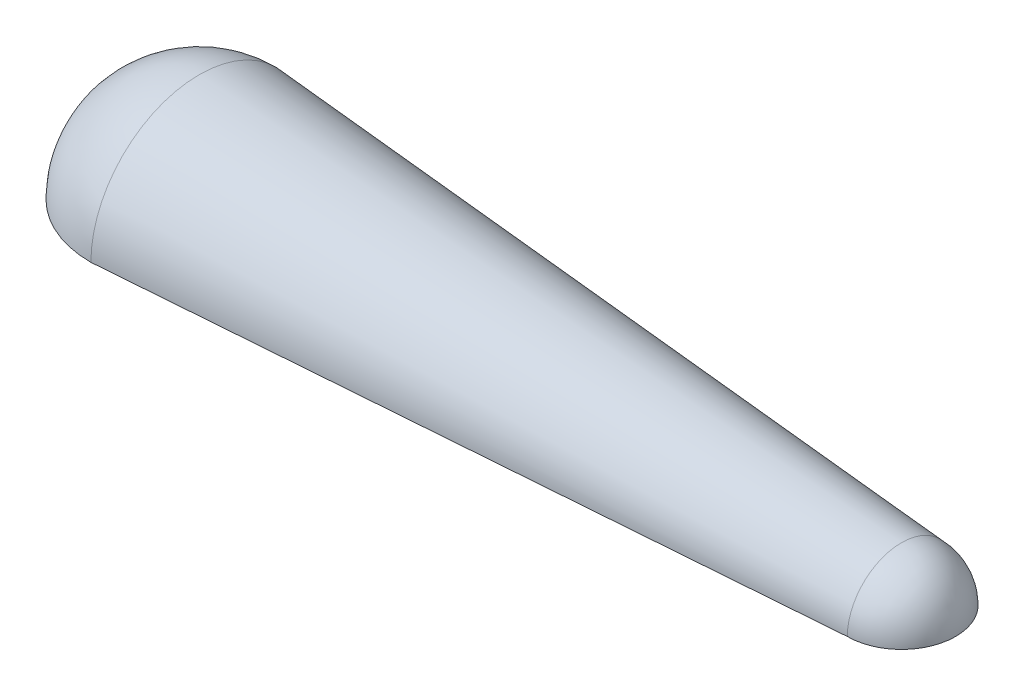
ISO-10303-21;
HEADER;
FILE_DESCRIPTION(('STEP AP214'),'2;1');
FILE_NAME('part.step','',(''),(''),'','','');
FILE_SCHEMA(('AUTOMOTIVE_DESIGN { 1 0 10303 214 1 1 1 1 }'));
ENDSEC;
DATA;
#1=APPLICATION_CONTEXT('core data for automotive mechanical design processes');
#2=APPLICATION_PROTOCOL_DEFINITION('international standard','automotive_design',2000,#1);
#3=PRODUCT_CONTEXT('',#1,'mechanical');
#4=PRODUCT('Part','Part','',(#3));
#5=PRODUCT_RELATED_PRODUCT_CATEGORY('part','',(#4));
#6=PRODUCT_DEFINITION_FORMATION('','',#4);
#7=PRODUCT_DEFINITION_CONTEXT('part definition',#1,'design');
#8=PRODUCT_DEFINITION('design','',#6,#7);
#9=PRODUCT_DEFINITION_SHAPE('','',#8);
#10=(LENGTH_UNIT() NAMED_UNIT(*) SI_UNIT(.MILLI.,.METRE.));
#11=(NAMED_UNIT(*) PLANE_ANGLE_UNIT() SI_UNIT($,.RADIAN.));
#12=(NAMED_UNIT(*) SI_UNIT($,.STERADIAN.) SOLID_ANGLE_UNIT());
#13=UNCERTAINTY_MEASURE_WITH_UNIT(LENGTH_MEASURE(1.E-05),#10,'distance_accuracy_value','');
#14=(GEOMETRIC_REPRESENTATION_CONTEXT(3) GLOBAL_UNCERTAINTY_ASSIGNED_CONTEXT((#13)) GLOBAL_UNIT_ASSIGNED_CONTEXT((#10,
#11,#12)) REPRESENTATION_CONTEXT('',''));
#15=CARTESIAN_POINT('',(0.,0.,0.));
#16=DIRECTION('',(0.,0.,1.));
#17=DIRECTION('',(1.,0.,0.));
#18=AXIS2_PLACEMENT_3D('',#15,#16,#17);
#19=CARTESIAN_POINT('',(0.,0.,0.));
#20=DIRECTION('',(-1.,0.,0.));
#21=DIRECTION('',(0.,0.,1.));
#22=AXIS2_PLACEMENT_3D('',#19,#20,#21);
#23=SPHERICAL_SURFACE('',#22,18.5169503651855);
#24=CARTESIAN_POINT('',(0.,0.,0.));
#25=DIRECTION('',(-1.,0.,0.));
#26=DIRECTION('',(0.,0.,1.));
#27=AXIS2_PLACEMENT_3D('',#24,#25,#26);
#28=CIRCLE('',#27,18.5169503651855);
#29=CARTESIAN_POINT('',(0.,-1.29303173304659E-13,18.5169503651855));
#30=VERTEX_POINT('',#29);
#31=CARTESIAN_POINT('',(0.,0.,-18.5169503651855));
#32=VERTEX_POINT('',#31);
#33=EDGE_CURVE('E58',#30,#32,#28,.T.);
#34=ORIENTED_EDGE('',*,*,#33,.T.);
#35=CARTESIAN_POINT('',(0.,0.,0.));
#36=DIRECTION('',(0.,-1.,0.));
#37=DIRECTION('',(0.,0.,-1.));
#38=AXIS2_PLACEMENT_3D('',#35,#36,#37);
#39=CIRCLE('',#38,18.5169503651855);
#40=EDGE_CURVE('E92',#30,#32,#39,.T.);
#41=ORIENTED_EDGE('',*,*,#40,.F.);
#42=EDGE_LOOP('',(#34,#41));
#43=FACE_BOUND('',#42,.T.);
#44=ADVANCED_FACE('F42',(#43),#23,.T.);
#45=CARTESIAN_POINT('',(0.,0.,0.));
#46=DIRECTION('',(-1.,0.,0.));
#47=DIRECTION('',(0.,0.,1.));
#48=AXIS2_PLACEMENT_3D('',#45,#46,#47);
#49=SPHERICAL_SURFACE('',#48,14.);
#50=CARTESIAN_POINT('',(0.,0.,0.));
#51=DIRECTION('',(-1.,0.,0.));
#52=DIRECTION('',(0.,0.,1.));
#53=AXIS2_PLACEMENT_3D('',#50,#51,#52);
#54=CIRCLE('',#53,14.);
#55=CARTESIAN_POINT('',(0.,0.,14.));
#56=VERTEX_POINT('',#55);
#57=CARTESIAN_POINT('',(0.,0.,-14.));
#58=VERTEX_POINT('',#57);
#59=EDGE_CURVE('E11',#56,#58,#54,.T.);
#60=ORIENTED_EDGE('',*,*,#59,.F.);
#61=CARTESIAN_POINT('',(0.,0.,0.));
#62=DIRECTION('',(0.,1.,0.));
#63=DIRECTION('',(0.,0.,-1.));
#64=AXIS2_PLACEMENT_3D('',#61,#62,#63);
#65=CIRCLE('',#64,14.);
#66=EDGE_CURVE('E85',#58,#56,#65,.T.);
#67=ORIENTED_EDGE('',*,*,#66,.F.);
#68=EDGE_LOOP('',(#60,#67));
#69=FACE_BOUND('',#68,.T.);
#70=ADVANCED_FACE('F44',(#69),#49,.F.);
#71=CARTESIAN_POINT('',(0.,0.,0.));
#72=DIRECTION('',(-1.,0.,0.));
#73=DIRECTION('',(0.,0.,1.));
#74=AXIS2_PLACEMENT_3D('',#71,#72,#73);
#75=CONICAL_SURFACE('',#74,14.,0.0665681637758238);
#76=CARTESIAN_POINT('',(120.,0.,0.));
#77=DIRECTION('',(-1.,0.,0.));
#78=DIRECTION('',(0.,0.,1.));
#79=AXIS2_PLACEMENT_3D('',#76,#77,#78);
#80=CIRCLE('',#79,6.);
#81=CARTESIAN_POINT('',(120.,0.,6.));
#82=VERTEX_POINT('',#81);
#83=CARTESIAN_POINT('',(120.,0.,-6.));
#84=VERTEX_POINT('',#83);
#85=EDGE_CURVE('E51',#82,#84,#80,.T.);
#86=ORIENTED_EDGE('',*,*,#85,.F.);
#87=DIRECTION('',(0.997785157856609,0.,-0.0665190105237739));
#88=VECTOR('',#87,1.);
#89=CARTESIAN_POINT('',(0.,0.,14.));
#90=LINE('',#89,#88);
#91=EDGE_CURVE('E91',#56,#82,#90,.T.);
#92=ORIENTED_EDGE('',*,*,#91,.F.);
#93=ORIENTED_EDGE('',*,*,#59,.T.);
#94=DIRECTION('',(0.997785157856609,0.,0.0665190105237739));
#95=VECTOR('',#94,1.);
#96=CARTESIAN_POINT('',(0.,0.,-14.));
#97=LINE('',#96,#95);
#98=EDGE_CURVE('E97',#58,#84,#97,.T.);
#99=ORIENTED_EDGE('',*,*,#98,.T.);
#100=EDGE_LOOP('',(#86,#92,#93,#99));
#101=FACE_BOUND('',#100,.T.);
#102=ADVANCED_FACE('F96',(#101),#75,.F.);
#103=CARTESIAN_POINT('',(120.,0.,0.));
#104=DIRECTION('',(-1.,0.,0.));
#105=DIRECTION('',(0.,0.,1.));
#106=AXIS2_PLACEMENT_3D('',#103,#104,#105);
#107=SPHERICAL_SURFACE('',#106,6.);
#108=ORIENTED_EDGE('',*,*,#85,.T.);
#109=CARTESIAN_POINT('',(120.,0.,0.));
#110=DIRECTION('',(0.,1.,0.));
#111=DIRECTION('',(0.,0.,-1.));
#112=AXIS2_PLACEMENT_3D('',#109,#110,#111);
#113=CIRCLE('',#112,6.);
#114=EDGE_CURVE('E101',#82,#84,#113,.T.);
#115=ORIENTED_EDGE('',*,*,#114,.F.);
#116=EDGE_LOOP('',(#108,#115));
#117=FACE_BOUND('',#116,.T.);
#118=ADVANCED_FACE('F135',(#117),#107,.F.);
#119=CARTESIAN_POINT('',(120.,0.,0.));
#120=DIRECTION('',(-1.,0.,0.));
#121=DIRECTION('',(0.,0.,1.));
#122=AXIS2_PLACEMENT_3D('',#119,#120,#121);
#123=SPHERICAL_SURFACE('',#122,9.25847518259273);
#124=CARTESIAN_POINT('',(120.,0.,0.));
#125=DIRECTION('',(-1.,0.,0.));
#126=DIRECTION('',(0.,0.,1.));
#127=AXIS2_PLACEMENT_3D('',#124,#125,#126);
#128=CIRCLE('',#127,9.25847518259273);
#129=CARTESIAN_POINT('',(120.,0.,9.25847518259273));
#130=VERTEX_POINT('',#129);
#131=CARTESIAN_POINT('',(120.,0.,-9.25847518259273));
#132=VERTEX_POINT('',#131);
#133=EDGE_CURVE('E65',#130,#132,#128,.T.);
#134=ORIENTED_EDGE('',*,*,#133,.F.);
#135=CARTESIAN_POINT('',(120.,0.,0.));
#136=DIRECTION('',(0.,-1.,0.));
#137=DIRECTION('',(0.,0.,-1.));
#138=AXIS2_PLACEMENT_3D('',#135,#136,#137);
#139=CIRCLE('',#138,9.25847518259273);
#140=EDGE_CURVE('E123',#132,#130,#139,.T.);
#141=ORIENTED_EDGE('',*,*,#140,.F.);
#142=EDGE_LOOP('',(#134,#141));
#143=FACE_BOUND('',#142,.T.);
#144=ADVANCED_FACE('F137',(#143),#123,.T.);
#145=CARTESIAN_POINT('',(120.,0.,0.));
#146=DIRECTION('',(-1.,0.,0.));
#147=DIRECTION('',(0.,0.,1.));
#148=AXIS2_PLACEMENT_3D('',#145,#146,#147);
#149=CONICAL_SURFACE('',#148,9.25847518259273,0.0770014120103553);
#150=DIRECTION('',(-0.997036855802212,0.,0.0769253415464591));
#151=VECTOR('',#150,1.);
#152=CARTESIAN_POINT('',(0.,-1.29303173304659E-13,18.5169503651855));
#153=LINE('',#152,#151);
#154=EDGE_CURVE('E126',#130,#30,#153,.T.);
#155=ORIENTED_EDGE('',*,*,#154,.F.);
#156=ORIENTED_EDGE('',*,*,#133,.T.);
#157=DIRECTION('',(-0.997036855802212,0.,-0.0769253415464591));
#158=VECTOR('',#157,1.);
#159=CARTESIAN_POINT('',(0.,0.,-18.5169503651855));
#160=LINE('',#159,#158);
#161=EDGE_CURVE('E104',#132,#32,#160,.T.);
#162=ORIENTED_EDGE('',*,*,#161,.T.);
#163=ORIENTED_EDGE('',*,*,#33,.F.);
#164=EDGE_LOOP('',(#155,#156,#162,#163));
#165=FACE_BOUND('',#164,.T.);
#166=ADVANCED_FACE('F143',(#165),#149,.T.);
#167=CARTESIAN_POINT('',(0.,0.,0.));
#168=DIRECTION('',(0.,-1.,0.));
#169=DIRECTION('',(0.,0.,-1.));
#170=AXIS2_PLACEMENT_3D('',#167,#168,#169);
#171=PLANE('',#170);
#172=CARTESIAN_POINT('',(-16.,0.,0.));
#173=DIRECTION('',(0.,-1.,0.));
#174=DIRECTION('',(0.,0.,-1.));
#175=AXIS2_PLACEMENT_3D('',#172,#173,#174);
#176=CIRCLE('',#175,1.);
#177=CARTESIAN_POINT('',(-16.,0.,-1.));
#178=VERTEX_POINT('',#177);
#179=EDGE_CURVE('E111',#178,#178,#176,.T.);
#180=ORIENTED_EDGE('',*,*,#179,.F.);
#181=EDGE_LOOP('',(#180));
#182=FACE_BOUND('',#181,.T.);
#183=CARTESIAN_POINT('',(0.,-1.1172740284298E-13,16.));
#184=DIRECTION('',(0.,-1.,0.));
#185=DIRECTION('',(0.,0.,-1.));
#186=AXIS2_PLACEMENT_3D('',#183,#184,#185);
#187=CIRCLE('',#186,1.);
#188=CARTESIAN_POINT('',(0.,-1.04744440165294E-13,15.));
#189=VERTEX_POINT('',#188);
#190=EDGE_CURVE('E174',#189,#189,#187,.T.);
#191=ORIENTED_EDGE('',*,*,#190,.F.);
#192=EDGE_LOOP('',(#191));
#193=FACE_BOUND('',#192,.T.);
#194=CARTESIAN_POINT('',(0.,1.1172740284298E-13,-16.));
#195=DIRECTION('',(0.,-1.,0.));
#196=DIRECTION('',(0.,0.,-1.));
#197=AXIS2_PLACEMENT_3D('',#194,#195,#196);
#198=CIRCLE('',#197,1.);
#199=CARTESIAN_POINT('',(0.,1.18710365520667E-13,-17.));
#200=VERTEX_POINT('',#199);
#201=EDGE_CURVE('E178',#200,#200,#198,.T.);
#202=ORIENTED_EDGE('',*,*,#201,.F.);
#203=EDGE_LOOP('',(#202));
#204=FACE_BOUND('',#203,.T.);
#205=CARTESIAN_POINT('',(127.5,0.,0.));
#206=DIRECTION('',(0.,-1.,0.));
#207=DIRECTION('',(0.,0.,-1.));
#208=AXIS2_PLACEMENT_3D('',#205,#206,#207);
#209=CIRCLE('',#208,0.999999999999998);
#210=CARTESIAN_POINT('',(127.5,0.,-0.999999999999998));
#211=VERTEX_POINT('',#210);
#212=EDGE_CURVE('E181',#211,#211,#209,.T.);
#213=ORIENTED_EDGE('',*,*,#212,.F.);
#214=EDGE_LOOP('',(#213));
#215=FACE_BOUND('',#214,.T.);
#216=ORIENTED_EDGE('',*,*,#98,.F.);
#217=ORIENTED_EDGE('',*,*,#66,.T.);
#218=ORIENTED_EDGE('',*,*,#91,.T.);
#219=ORIENTED_EDGE('',*,*,#114,.T.);
#220=EDGE_LOOP('',(#216,#217,#218,#219));
#221=FACE_BOUND('',#220,.T.);
#222=ORIENTED_EDGE('',*,*,#40,.T.);
#223=ORIENTED_EDGE('',*,*,#161,.F.);
#224=ORIENTED_EDGE('',*,*,#140,.T.);
#225=ORIENTED_EDGE('',*,*,#154,.T.);
#226=EDGE_LOOP('',(#222,#223,#224,#225));
#227=FACE_BOUND('',#226,.T.);
#228=ADVANCED_FACE('F98',(#182,#193,#204,#215,#221,#227),#171,.T.);
#229=CARTESIAN_POINT('',(127.5,2.5,0.));
#230=DIRECTION('',(0.,-1.,0.));
#231=DIRECTION('',(0.,0.,-1.));
#232=AXIS2_PLACEMENT_3D('',#229,#230,#231);
#233=CYLINDRICAL_SURFACE('',#232,0.999999999999998);
#234=CARTESIAN_POINT('',(127.5,2.5,0.));
#235=DIRECTION('',(0.,-1.,0.));
#236=DIRECTION('',(0.,0.,-1.));
#237=AXIS2_PLACEMENT_3D('',#234,#235,#236);
#238=CIRCLE('',#237,0.999999999999998);
#239=CARTESIAN_POINT('',(127.5,2.50000000000001,-0.99999999999998));
#240=VERTEX_POINT('',#239);
#241=EDGE_CURVE('E114',#240,#240,#238,.T.);
#242=ORIENTED_EDGE('',*,*,#241,.F.);
#243=EDGE_LOOP('',(#242));
#244=FACE_BOUND('',#243,.T.);
#245=ORIENTED_EDGE('',*,*,#212,.T.);
#246=EDGE_LOOP('',(#245));
#247=FACE_BOUND('',#246,.T.);
#248=ADVANCED_FACE('F159',(#244,#247),#233,.F.);
#249=CARTESIAN_POINT('',(127.5,2.5,0.));
#250=DIRECTION('',(0.,-1.,0.));
#251=DIRECTION('',(0.,0.,-1.));
#252=AXIS2_PLACEMENT_3D('',#249,#250,#251);
#253=PLANE('',#252);
#254=ORIENTED_EDGE('',*,*,#241,.T.);
#255=EDGE_LOOP('',(#254));
#256=FACE_BOUND('',#255,.T.);
#257=ADVANCED_FACE('F165',(#256),#253,.T.);
#258=CARTESIAN_POINT('',(0.,2.50000000000011,-16.));
#259=DIRECTION('',(0.,-1.,0.));
#260=DIRECTION('',(0.,0.,-1.));
#261=AXIS2_PLACEMENT_3D('',#258,#259,#260);
#262=CYLINDRICAL_SURFACE('',#261,1.);
#263=CARTESIAN_POINT('',(0.,2.50000000000011,-16.));
#264=DIRECTION('',(0.,-1.,0.));
#265=DIRECTION('',(0.,0.,-1.));
#266=AXIS2_PLACEMENT_3D('',#263,#264,#265);
#267=CIRCLE('',#266,1.);
#268=CARTESIAN_POINT('',(0.,2.50000000000012,-17.));
#269=VERTEX_POINT('',#268);
#270=EDGE_CURVE('E184',#269,#269,#267,.T.);
#271=ORIENTED_EDGE('',*,*,#270,.F.);
#272=EDGE_LOOP('',(#271));
#273=FACE_BOUND('',#272,.T.);
#274=ORIENTED_EDGE('',*,*,#201,.T.);
#275=EDGE_LOOP('',(#274));
#276=FACE_BOUND('',#275,.T.);
#277=ADVANCED_FACE('F222',(#273,#276),#262,.F.);
#278=CARTESIAN_POINT('',(0.,2.50000000000011,-16.));
#279=DIRECTION('',(0.,-1.,0.));
#280=DIRECTION('',(0.,0.,-1.));
#281=AXIS2_PLACEMENT_3D('',#278,#279,#280);
#282=PLANE('',#281);
#283=ORIENTED_EDGE('',*,*,#270,.T.);
#284=EDGE_LOOP('',(#283));
#285=FACE_BOUND('',#284,.T.);
#286=ADVANCED_FACE('F219',(#285),#282,.T.);
#287=CARTESIAN_POINT('',(0.,2.49999999999989,16.));
#288=DIRECTION('',(0.,-1.,0.));
#289=DIRECTION('',(0.,0.,-1.));
#290=AXIS2_PLACEMENT_3D('',#287,#288,#289);
#291=CYLINDRICAL_SURFACE('',#290,1.);
#292=CARTESIAN_POINT('',(0.,2.49999999999989,16.));
#293=DIRECTION('',(0.,-1.,0.));
#294=DIRECTION('',(0.,0.,-1.));
#295=AXIS2_PLACEMENT_3D('',#292,#293,#294);
#296=CIRCLE('',#295,1.);
#297=CARTESIAN_POINT('',(0.,2.4999999999999,15.));
#298=VERTEX_POINT('',#297);
#299=EDGE_CURVE('E193',#298,#298,#296,.T.);
#300=ORIENTED_EDGE('',*,*,#299,.F.);
#301=EDGE_LOOP('',(#300));
#302=FACE_BOUND('',#301,.T.);
#303=ORIENTED_EDGE('',*,*,#190,.T.);
#304=EDGE_LOOP('',(#303));
#305=FACE_BOUND('',#304,.T.);
#306=ADVANCED_FACE('F213',(#302,#305),#291,.F.);
#307=CARTESIAN_POINT('',(0.,2.49999999999989,16.));
#308=DIRECTION('',(0.,-1.,0.));
#309=DIRECTION('',(0.,0.,-1.));
#310=AXIS2_PLACEMENT_3D('',#307,#308,#309);
#311=PLANE('',#310);
#312=ORIENTED_EDGE('',*,*,#299,.T.);
#313=EDGE_LOOP('',(#312));
#314=FACE_BOUND('',#313,.T.);
#315=ADVANCED_FACE('F204',(#314),#311,.T.);
#316=CARTESIAN_POINT('',(-16.,2.5,0.));
#317=DIRECTION('',(0.,-1.,0.));
#318=DIRECTION('',(0.,0.,-1.));
#319=AXIS2_PLACEMENT_3D('',#316,#317,#318);
#320=CYLINDRICAL_SURFACE('',#319,1.);
#321=CARTESIAN_POINT('',(-16.,2.5,0.));
#322=DIRECTION('',(0.,-1.,0.));
#323=DIRECTION('',(0.,0.,-1.));
#324=AXIS2_PLACEMENT_3D('',#321,#322,#323);
#325=CIRCLE('',#324,1.);
#326=CARTESIAN_POINT('',(-16.,2.50000000000001,-0.999999999999984));
#327=VERTEX_POINT('',#326);
#328=EDGE_CURVE('E105',#327,#327,#325,.T.);
#329=ORIENTED_EDGE('',*,*,#328,.F.);
#330=EDGE_LOOP('',(#329));
#331=FACE_BOUND('',#330,.T.);
#332=ORIENTED_EDGE('',*,*,#179,.T.);
#333=EDGE_LOOP('',(#332));
#334=FACE_BOUND('',#333,.T.);
#335=ADVANCED_FACE('F201',(#331,#334),#320,.F.);
#336=CARTESIAN_POINT('',(-16.,2.5,0.));
#337=DIRECTION('',(0.,-1.,0.));
#338=DIRECTION('',(0.,0.,-1.));
#339=AXIS2_PLACEMENT_3D('',#336,#337,#338);
#340=PLANE('',#339);
#341=ORIENTED_EDGE('',*,*,#328,.T.);
#342=EDGE_LOOP('',(#341));
#343=FACE_BOUND('',#342,.T.);
#344=ADVANCED_FACE('F203',(#343),#340,.T.);
#345=CLOSED_SHELL('',(#44,#70,#102,#118,#144,#166,#228,#248,#257,#277,#286,#306,#315,#335,#344));
#346=MANIFOLD_SOLID_BREP('B2',#345);
#347=ADVANCED_BREP_SHAPE_REPRESENTATION('',(#18,#346),#14);
#348=SHAPE_DEFINITION_REPRESENTATION(#9,#347);
ENDSEC;
END-ISO-10303-21;
